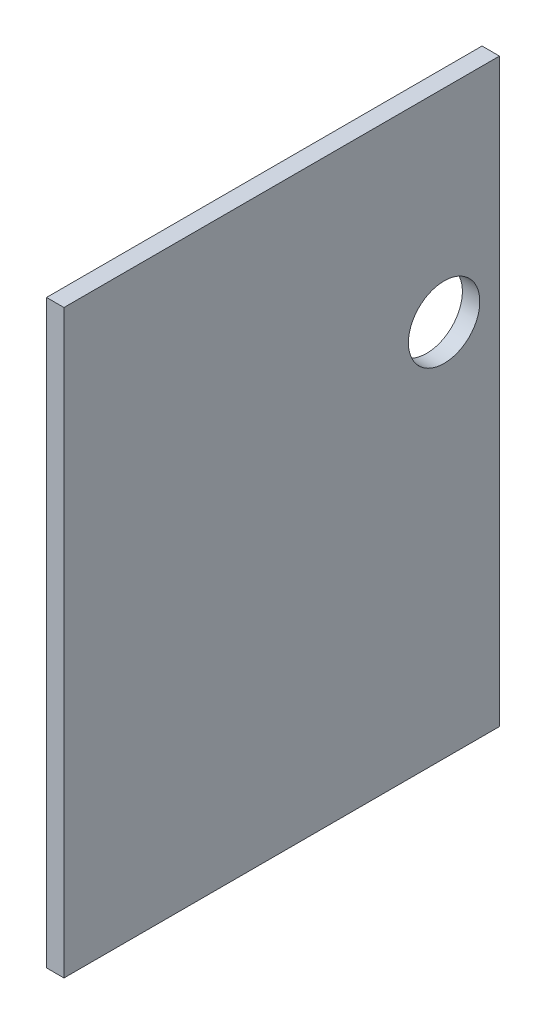
ISO-10303-21;
HEADER;
FILE_DESCRIPTION(('STEP AP214'),'2;1');
FILE_NAME('part.step','',(''),(''),'','','');
FILE_SCHEMA(('AUTOMOTIVE_DESIGN { 1 0 10303 214 1 1 1 1 }'));
ENDSEC;
DATA;
#1=APPLICATION_CONTEXT('core data for automotive mechanical design processes');
#2=APPLICATION_PROTOCOL_DEFINITION('international standard','automotive_design',2000,#1);
#3=PRODUCT_CONTEXT('',#1,'mechanical');
#4=PRODUCT('Part','Part','',(#3));
#5=PRODUCT_RELATED_PRODUCT_CATEGORY('part','',(#4));
#6=PRODUCT_DEFINITION_FORMATION('','',#4);
#7=PRODUCT_DEFINITION_CONTEXT('part definition',#1,'design');
#8=PRODUCT_DEFINITION('design','',#6,#7);
#9=PRODUCT_DEFINITION_SHAPE('','',#8);
#10=(LENGTH_UNIT() NAMED_UNIT(*) SI_UNIT(.MILLI.,.METRE.));
#11=(NAMED_UNIT(*) PLANE_ANGLE_UNIT() SI_UNIT($,.RADIAN.));
#12=(NAMED_UNIT(*) SI_UNIT($,.STERADIAN.) SOLID_ANGLE_UNIT());
#13=UNCERTAINTY_MEASURE_WITH_UNIT(LENGTH_MEASURE(1.E-05),#10,'distance_accuracy_value','');
#14=(GEOMETRIC_REPRESENTATION_CONTEXT(3) GLOBAL_UNCERTAINTY_ASSIGNED_CONTEXT((#13)) GLOBAL_UNIT_ASSIGNED_CONTEXT((#10,
#11,#12)) REPRESENTATION_CONTEXT('',''));
#15=CARTESIAN_POINT('',(0.,0.,0.));
#16=DIRECTION('',(0.,0.,1.));
#17=DIRECTION('',(1.,0.,0.));
#18=AXIS2_PLACEMENT_3D('',#15,#16,#17);
#19=CARTESIAN_POINT('',(7.62,0.,0.));
#20=DIRECTION('',(-1.,0.,0.));
#21=DIRECTION('',(0.,0.,1.));
#22=AXIS2_PLACEMENT_3D('',#19,#20,#21);
#23=PLANE('',#22);
#24=DIRECTION('',(0.,1.,0.));
#25=VECTOR('',#24,1.);
#26=CARTESIAN_POINT('',(7.62,-127.,-95.25));
#27=LINE('',#26,#25);
#28=CARTESIAN_POINT('',(7.62,-127.,-95.25));
#29=VERTEX_POINT('',#28);
#30=CARTESIAN_POINT('',(7.62,127.,-95.25));
#31=VERTEX_POINT('',#30);
#32=EDGE_CURVE('E85',#29,#31,#27,.T.);
#33=ORIENTED_EDGE('',*,*,#32,.T.);
#34=DIRECTION('',(0.,0.,1.));
#35=VECTOR('',#34,1.);
#36=CARTESIAN_POINT('',(7.62,127.,95.25));
#37=LINE('',#36,#35);
#38=CARTESIAN_POINT('',(7.62,127.,95.25));
#39=VERTEX_POINT('',#38);
#40=EDGE_CURVE('E80',#31,#39,#37,.T.);
#41=ORIENTED_EDGE('',*,*,#40,.T.);
#42=DIRECTION('',(0.,-1.,0.));
#43=VECTOR('',#42,1.);
#44=CARTESIAN_POINT('',(7.62,-127.,95.25));
#45=LINE('',#44,#43);
#46=CARTESIAN_POINT('',(7.62,-127.,95.25));
#47=VERTEX_POINT('',#46);
#48=EDGE_CURVE('E83',#39,#47,#45,.T.);
#49=ORIENTED_EDGE('',*,*,#48,.T.);
#50=DIRECTION('',(0.,0.,-1.));
#51=VECTOR('',#50,1.);
#52=CARTESIAN_POINT('',(7.62,-127.,95.25));
#53=LINE('',#52,#51);
#54=EDGE_CURVE('E50',#47,#29,#53,.T.);
#55=ORIENTED_EDGE('',*,*,#54,.T.);
#56=EDGE_LOOP('',(#33,#41,#49,#55));
#57=FACE_BOUND('',#56,.T.);
#58=CARTESIAN_POINT('',(7.62,38.2950872534309,-71.0292947286857));
#59=DIRECTION('',(1.,0.,0.));
#60=DIRECTION('',(0.,0.,-1.));
#61=AXIS2_PLACEMENT_3D('',#58,#59,#60);
#62=CIRCLE('',#61,15.621);
#63=CARTESIAN_POINT('',(7.62,38.2950872534309,-55.4082947286857));
#64=VERTEX_POINT('',#63);
#65=EDGE_CURVE('E100',#64,#64,#62,.T.);
#66=ORIENTED_EDGE('',*,*,#65,.F.);
#67=EDGE_LOOP('',(#66));
#68=FACE_BOUND('',#67,.T.);
#69=ADVANCED_FACE('F33',(#57,#68),#23,.F.);
#70=CARTESIAN_POINT('',(0.,0.,0.));
#71=DIRECTION('',(-1.,0.,0.));
#72=DIRECTION('',(0.,0.,1.));
#73=AXIS2_PLACEMENT_3D('',#70,#71,#72);
#74=PLANE('',#73);
#75=DIRECTION('',(0.,1.,0.));
#76=VECTOR('',#75,1.);
#77=CARTESIAN_POINT('',(0.,-127.,-95.25));
#78=LINE('',#77,#76);
#79=CARTESIAN_POINT('',(0.,-127.,-95.25));
#80=VERTEX_POINT('',#79);
#81=CARTESIAN_POINT('',(0.,127.,-95.25));
#82=VERTEX_POINT('',#81);
#83=EDGE_CURVE('E97',#80,#82,#78,.T.);
#84=ORIENTED_EDGE('',*,*,#83,.F.);
#85=DIRECTION('',(0.,0.,-1.));
#86=VECTOR('',#85,1.);
#87=CARTESIAN_POINT('',(0.,-127.,95.25));
#88=LINE('',#87,#86);
#89=CARTESIAN_POINT('',(0.,-127.,95.25));
#90=VERTEX_POINT('',#89);
#91=EDGE_CURVE('E73',#90,#80,#88,.T.);
#92=ORIENTED_EDGE('',*,*,#91,.F.);
#93=DIRECTION('',(0.,-1.,0.));
#94=VECTOR('',#93,1.);
#95=CARTESIAN_POINT('',(0.,-127.,95.25));
#96=LINE('',#95,#94);
#97=CARTESIAN_POINT('',(0.,127.,95.25));
#98=VERTEX_POINT('',#97);
#99=EDGE_CURVE('E67',#98,#90,#96,.T.);
#100=ORIENTED_EDGE('',*,*,#99,.F.);
#101=DIRECTION('',(0.,0.,1.));
#102=VECTOR('',#101,1.);
#103=CARTESIAN_POINT('',(0.,127.,95.25));
#104=LINE('',#103,#102);
#105=EDGE_CURVE('E89',#82,#98,#104,.T.);
#106=ORIENTED_EDGE('',*,*,#105,.F.);
#107=EDGE_LOOP('',(#84,#92,#100,#106));
#108=FACE_BOUND('',#107,.T.);
#109=CARTESIAN_POINT('',(0.,38.2950872534309,-71.0292947286857));
#110=DIRECTION('',(1.,0.,0.));
#111=DIRECTION('',(0.,0.,-1.));
#112=AXIS2_PLACEMENT_3D('',#109,#110,#111);
#113=CIRCLE('',#112,15.621);
#114=CARTESIAN_POINT('',(0.,38.2950872534309,-55.4082947286857));
#115=VERTEX_POINT('',#114);
#116=EDGE_CURVE('E112',#115,#115,#113,.T.);
#117=ORIENTED_EDGE('',*,*,#116,.T.);
#118=EDGE_LOOP('',(#117));
#119=FACE_BOUND('',#118,.T.);
#120=ADVANCED_FACE('F108',(#108,#119),#74,.T.);
#121=CARTESIAN_POINT('',(7.62,-127.,-95.25));
#122=DIRECTION('',(0.,0.,1.));
#123=DIRECTION('',(1.,0.,0.));
#124=AXIS2_PLACEMENT_3D('',#121,#122,#123);
#125=PLANE('',#124);
#126=ORIENTED_EDGE('',*,*,#83,.T.);
#127=DIRECTION('',(-1.,0.,0.));
#128=VECTOR('',#127,1.);
#129=CARTESIAN_POINT('',(7.62,127.,-95.25));
#130=LINE('',#129,#128);
#131=EDGE_CURVE('E11',#31,#82,#130,.T.);
#132=ORIENTED_EDGE('',*,*,#131,.F.);
#133=ORIENTED_EDGE('',*,*,#32,.F.);
#134=DIRECTION('',(-1.,0.,0.));
#135=VECTOR('',#134,1.);
#136=CARTESIAN_POINT('',(7.62,-127.,-95.25));
#137=LINE('',#136,#135);
#138=EDGE_CURVE('E93',#29,#80,#137,.T.);
#139=ORIENTED_EDGE('',*,*,#138,.T.);
#140=EDGE_LOOP('',(#126,#132,#133,#139));
#141=FACE_BOUND('',#140,.T.);
#142=ADVANCED_FACE('F35',(#141),#125,.F.);
#143=CARTESIAN_POINT('',(7.62,127.,95.25));
#144=DIRECTION('',(0.,-1.,0.));
#145=DIRECTION('',(0.,0.,-1.));
#146=AXIS2_PLACEMENT_3D('',#143,#144,#145);
#147=PLANE('',#146);
#148=ORIENTED_EDGE('',*,*,#105,.T.);
#149=DIRECTION('',(-1.,0.,0.));
#150=VECTOR('',#149,1.);
#151=CARTESIAN_POINT('',(7.62,127.,95.25));
#152=LINE('',#151,#150);
#153=EDGE_CURVE('E42',#39,#98,#152,.T.);
#154=ORIENTED_EDGE('',*,*,#153,.F.);
#155=ORIENTED_EDGE('',*,*,#40,.F.);
#156=ORIENTED_EDGE('',*,*,#131,.T.);
#157=EDGE_LOOP('',(#148,#154,#155,#156));
#158=FACE_BOUND('',#157,.T.);
#159=ADVANCED_FACE('F88',(#158),#147,.F.);
#160=CARTESIAN_POINT('',(7.62,-127.,95.25));
#161=DIRECTION('',(0.,0.,-1.));
#162=DIRECTION('',(-1.,0.,0.));
#163=AXIS2_PLACEMENT_3D('',#160,#161,#162);
#164=PLANE('',#163);
#165=ORIENTED_EDGE('',*,*,#99,.T.);
#166=DIRECTION('',(-1.,0.,0.));
#167=VECTOR('',#166,1.);
#168=CARTESIAN_POINT('',(7.62,-127.,95.25));
#169=LINE('',#168,#167);
#170=EDGE_CURVE('E90',#47,#90,#169,.T.);
#171=ORIENTED_EDGE('',*,*,#170,.F.);
#172=ORIENTED_EDGE('',*,*,#48,.F.);
#173=ORIENTED_EDGE('',*,*,#153,.T.);
#174=EDGE_LOOP('',(#165,#171,#172,#173));
#175=FACE_BOUND('',#174,.T.);
#176=ADVANCED_FACE('F91',(#175),#164,.F.);
#177=CARTESIAN_POINT('',(7.62,-127.,95.25));
#178=DIRECTION('',(0.,1.,0.));
#179=DIRECTION('',(0.,0.,1.));
#180=AXIS2_PLACEMENT_3D('',#177,#178,#179);
#181=PLANE('',#180);
#182=ORIENTED_EDGE('',*,*,#91,.T.);
#183=ORIENTED_EDGE('',*,*,#138,.F.);
#184=ORIENTED_EDGE('',*,*,#54,.F.);
#185=ORIENTED_EDGE('',*,*,#170,.T.);
#186=EDGE_LOOP('',(#182,#183,#184,#185));
#187=FACE_BOUND('',#186,.T.);
#188=ADVANCED_FACE('F105',(#187),#181,.F.);
#189=CARTESIAN_POINT('',(7.62,38.2950872534309,-71.0292947286857));
#190=DIRECTION('',(-1.,0.,0.));
#191=DIRECTION('',(0.,0.,1.));
#192=AXIS2_PLACEMENT_3D('',#189,#190,#191);
#193=CYLINDRICAL_SURFACE('',#192,15.621);
#194=CARTESIAN_POINT('',(7.62,38.2950872534309,-55.4082947286857));
#195=CARTESIAN_POINT('',(7.540625,38.2950872534309,-55.4082947286857));
#196=CARTESIAN_POINT('',(7.46125,38.2950872534309,-55.4082947286857));
#197=CARTESIAN_POINT('',(7.3025,38.2950872534309,-55.4082947286857));
#198=CARTESIAN_POINT('',(7.223125,38.2950872534309,-55.4082947286857));
#199=CARTESIAN_POINT('',(7.064375,38.2950872534309,-55.4082947286857));
#200=CARTESIAN_POINT('',(6.985,38.2950872534309,-55.4082947286857));
#201=CARTESIAN_POINT('',(6.82625,38.2950872534309,-55.4082947286857));
#202=CARTESIAN_POINT('',(6.746875,38.2950872534309,-55.4082947286857));
#203=CARTESIAN_POINT('',(6.588125,38.2950872534309,-55.4082947286857));
#204=CARTESIAN_POINT('',(6.50875,38.2950872534309,-55.4082947286857));
#205=CARTESIAN_POINT('',(6.35,38.2950872534309,-55.4082947286857));
#206=CARTESIAN_POINT('',(6.270625,38.2950872534309,-55.4082947286857));
#207=CARTESIAN_POINT('',(6.111875,38.2950872534309,-55.4082947286857));
#208=CARTESIAN_POINT('',(6.0325,38.2950872534309,-55.4082947286857));
#209=CARTESIAN_POINT('',(5.87375,38.2950872534309,-55.4082947286857));
#210=CARTESIAN_POINT('',(5.794375,38.2950872534309,-55.4082947286857));
#211=CARTESIAN_POINT('',(5.635625,38.2950872534309,-55.4082947286857));
#212=CARTESIAN_POINT('',(5.55625,38.2950872534309,-55.4082947286857));
#213=CARTESIAN_POINT('',(5.3975,38.2950872534309,-55.4082947286857));
#214=CARTESIAN_POINT('',(5.318125,38.2950872534309,-55.4082947286857));
#215=CARTESIAN_POINT('',(5.159375,38.2950872534309,-55.4082947286857));
#216=CARTESIAN_POINT('',(5.08,38.2950872534309,-55.4082947286857));
#217=CARTESIAN_POINT('',(4.92125,38.2950872534309,-55.4082947286857));
#218=CARTESIAN_POINT('',(4.841875,38.2950872534309,-55.4082947286857));
#219=CARTESIAN_POINT('',(4.683125,38.2950872534309,-55.4082947286857));
#220=CARTESIAN_POINT('',(4.60375,38.2950872534309,-55.4082947286857));
#221=CARTESIAN_POINT('',(4.445,38.2950872534309,-55.4082947286857));
#222=CARTESIAN_POINT('',(4.365625,38.2950872534309,-55.4082947286857));
#223=CARTESIAN_POINT('',(4.206875,38.2950872534309,-55.4082947286857));
#224=CARTESIAN_POINT('',(4.1275,38.2950872534309,-55.4082947286857));
#225=CARTESIAN_POINT('',(3.96875,38.2950872534309,-55.4082947286857));
#226=CARTESIAN_POINT('',(3.889375,38.2950872534309,-55.4082947286857));
#227=CARTESIAN_POINT('',(3.730625,38.2950872534309,-55.4082947286857));
#228=CARTESIAN_POINT('',(3.65125,38.2950872534309,-55.4082947286857));
#229=CARTESIAN_POINT('',(3.4925,38.2950872534309,-55.4082947286857));
#230=CARTESIAN_POINT('',(3.413125,38.2950872534309,-55.4082947286857));
#231=CARTESIAN_POINT('',(3.254375,38.2950872534309,-55.4082947286857));
#232=CARTESIAN_POINT('',(3.175,38.2950872534309,-55.4082947286857));
#233=CARTESIAN_POINT('',(3.01625,38.2950872534309,-55.4082947286857));
#234=CARTESIAN_POINT('',(2.936875,38.2950872534309,-55.4082947286857));
#235=CARTESIAN_POINT('',(2.778125,38.2950872534309,-55.4082947286857));
#236=CARTESIAN_POINT('',(2.69875,38.2950872534309,-55.4082947286857));
#237=CARTESIAN_POINT('',(2.54,38.2950872534309,-55.4082947286857));
#238=CARTESIAN_POINT('',(2.460625,38.2950872534309,-55.4082947286857));
#239=CARTESIAN_POINT('',(2.301875,38.2950872534309,-55.4082947286857));
#240=CARTESIAN_POINT('',(2.2225,38.2950872534309,-55.4082947286857));
#241=CARTESIAN_POINT('',(2.06375,38.2950872534309,-55.4082947286857));
#242=CARTESIAN_POINT('',(1.984375,38.2950872534309,-55.4082947286857));
#243=CARTESIAN_POINT('',(1.825625,38.2950872534309,-55.4082947286857));
#244=CARTESIAN_POINT('',(1.74625,38.2950872534309,-55.4082947286857));
#245=CARTESIAN_POINT('',(1.5875,38.2950872534309,-55.4082947286857));
#246=CARTESIAN_POINT('',(1.508125,38.2950872534309,-55.4082947286857));
#247=CARTESIAN_POINT('',(1.349375,38.2950872534309,-55.4082947286857));
#248=CARTESIAN_POINT('',(1.27,38.2950872534309,-55.4082947286857));
#249=CARTESIAN_POINT('',(1.11125,38.2950872534309,-55.4082947286857));
#250=CARTESIAN_POINT('',(1.031875,38.2950872534309,-55.4082947286857));
#251=CARTESIAN_POINT('',(0.873125,38.2950872534309,-55.4082947286857));
#252=CARTESIAN_POINT('',(0.79375,38.2950872534309,-55.4082947286857));
#253=CARTESIAN_POINT('',(0.635,38.2950872534309,-55.4082947286857));
#254=CARTESIAN_POINT('',(0.555625,38.2950872534309,-55.4082947286857));
#255=CARTESIAN_POINT('',(0.396875,38.2950872534309,-55.4082947286857));
#256=CARTESIAN_POINT('',(0.3175,38.2950872534309,-55.4082947286857));
#257=CARTESIAN_POINT('',(0.15875,38.2950872534309,-55.4082947286857));
#258=CARTESIAN_POINT('',(0.0793749999999999,38.2950872534309,-55.4082947286857));
#259=CARTESIAN_POINT('',(0.,38.2950872534309,-55.4082947286857));
#260=B_SPLINE_CURVE_WITH_KNOTS('',3,(#194,#195,#196,#197,#198,#199,#200,#201,#202,#203,#204,
#205,#206,#207,#208,#209,#210,#211,#212,#213,#214,#215,#216,#217,#218,#219,#220,#221,#222,#223,
#224,#225,#226,#227,#228,#229,#230,#231,#232,#233,#234,#235,#236,#237,#238,#239,#240,#241,#242,
#243,#244,#245,#246,#247,#248,#249,#250,#251,#252,#253,#254,#255,#256,#257,#258,#259),
.UNSPECIFIED.,.F.,.F.,(4,2,2,2,2,2,2,2,2,2,2,2,2,2,2,2,2,2,2,2,2,2,2,2,2,2,2,2,2,2,2,2,4),(0.,
0.238125,0.47625,0.714375000000001,0.9525,1.190625,1.42875,1.666875,1.905,2.143125,2.38125,
2.619375,2.8575,3.095625,3.33375,3.571875,3.81,4.048125,4.28625,4.524375,4.7625,5.000625,
5.23875,5.476875,5.715,5.953125,6.19125,6.429375,6.6675,6.905625,7.14375,7.381875,7.62),.UNSPECIFIED.);
#261=EDGE_CURVE('BSEAM118',#64,#115,#260,.T.);
#262=ORIENTED_EDGE('',*,*,#65,.T.);
#263=ORIENTED_EDGE('',*,*,#116,.F.);
#264=ORIENTED_EDGE('',*,*,#261,.T.);
#265=ORIENTED_EDGE('',*,*,#261,.F.);
#266=EDGE_LOOP('',(#262,#264,#263,#265));
#267=FACE_BOUND('',#266,.T.);
#268=ADVANCED_FACE('F118',(#267),#193,.F.);
#269=CLOSED_SHELL('',(#69,#120,#142,#159,#176,#188,#268));
#270=MANIFOLD_SOLID_BREP('B2',#269);
#271=ADVANCED_BREP_SHAPE_REPRESENTATION('',(#18,#270),#14);
#272=SHAPE_DEFINITION_REPRESENTATION(#9,#271);
ENDSEC;
END-ISO-10303-21;
